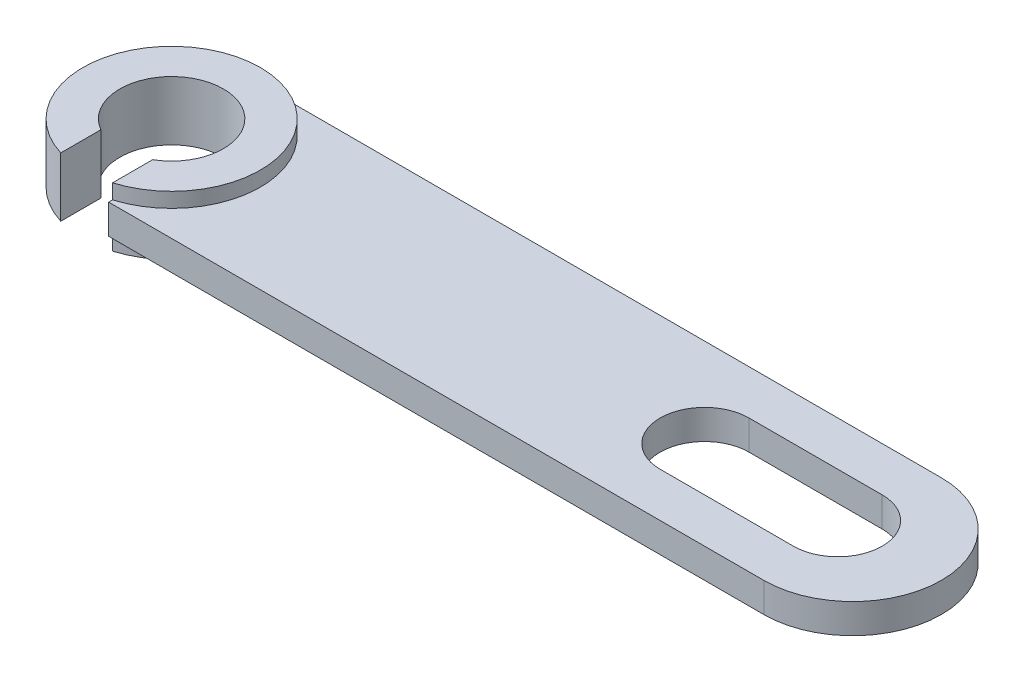
ISO-10303-21;
HEADER;
FILE_DESCRIPTION(('STEP AP214'),'2;1');
FILE_NAME('part.step','',(''),(''),'','','');
FILE_SCHEMA(('AUTOMOTIVE_DESIGN { 1 0 10303 214 1 1 1 1 }'));
ENDSEC;
DATA;
#1=APPLICATION_CONTEXT('core data for automotive mechanical design processes');
#2=APPLICATION_PROTOCOL_DEFINITION('international standard','automotive_design',2000,#1);
#3=PRODUCT_CONTEXT('',#1,'mechanical');
#4=PRODUCT('Part','Part','',(#3));
#5=PRODUCT_RELATED_PRODUCT_CATEGORY('part','',(#4));
#6=PRODUCT_DEFINITION_FORMATION('','',#4);
#7=PRODUCT_DEFINITION_CONTEXT('part definition',#1,'design');
#8=PRODUCT_DEFINITION('design','',#6,#7);
#9=PRODUCT_DEFINITION_SHAPE('','',#8);
#10=(LENGTH_UNIT() NAMED_UNIT(*) SI_UNIT(.MILLI.,.METRE.));
#11=(NAMED_UNIT(*) PLANE_ANGLE_UNIT() SI_UNIT($,.RADIAN.));
#12=(NAMED_UNIT(*) SI_UNIT($,.STERADIAN.) SOLID_ANGLE_UNIT());
#13=UNCERTAINTY_MEASURE_WITH_UNIT(LENGTH_MEASURE(1.E-05),#10,'distance_accuracy_value','');
#14=(GEOMETRIC_REPRESENTATION_CONTEXT(3) GLOBAL_UNCERTAINTY_ASSIGNED_CONTEXT((#13)) GLOBAL_UNIT_ASSIGNED_CONTEXT((#10,
#11,#12)) REPRESENTATION_CONTEXT('',''));
#15=CARTESIAN_POINT('',(0.,0.,0.));
#16=DIRECTION('',(0.,0.,1.));
#17=DIRECTION('',(1.,0.,0.));
#18=AXIS2_PLACEMENT_3D('',#15,#16,#17);
#19=CARTESIAN_POINT('',(-11.5,0.5,0.));
#20=DIRECTION('',(0.,1.,0.));
#21=DIRECTION('',(0.,0.,1.));
#22=AXIS2_PLACEMENT_3D('',#19,#20,#21);
#23=PLANE('',#22);
#24=DIRECTION('',(-1.,0.,0.));
#25=VECTOR('',#24,1.);
#26=CARTESIAN_POINT('',(11.,0.5,-1.5));
#27=LINE('',#26,#25);
#28=CARTESIAN_POINT('',(11.,0.5,-1.5));
#29=VERTEX_POINT('',#28);
#30=CARTESIAN_POINT('',(6.5,0.5,-1.5));
#31=VERTEX_POINT('',#30);
#32=EDGE_CURVE('E186',#29,#31,#27,.T.);
#33=ORIENTED_EDGE('',*,*,#32,.F.);
#34=CARTESIAN_POINT('',(11.,0.5,0.));
#35=DIRECTION('',(0.,1.,0.));
#36=DIRECTION('',(0.,0.,1.));
#37=AXIS2_PLACEMENT_3D('',#34,#35,#36);
#38=CIRCLE('',#37,1.5);
#39=CARTESIAN_POINT('',(11.,0.5,1.5));
#40=VERTEX_POINT('',#39);
#41=EDGE_CURVE('E184',#40,#29,#38,.T.);
#42=ORIENTED_EDGE('',*,*,#41,.F.);
#43=DIRECTION('',(1.,0.,0.));
#44=VECTOR('',#43,1.);
#45=CARTESIAN_POINT('',(11.,0.5,1.5));
#46=LINE('',#45,#44);
#47=CARTESIAN_POINT('',(6.5,0.5,1.5));
#48=VERTEX_POINT('',#47);
#49=EDGE_CURVE('E191',#48,#40,#46,.T.);
#50=ORIENTED_EDGE('',*,*,#49,.F.);
#51=CARTESIAN_POINT('',(6.5,0.5,0.));
#52=DIRECTION('',(0.,1.,0.));
#53=DIRECTION('',(0.,0.,1.));
#54=AXIS2_PLACEMENT_3D('',#51,#52,#53);
#55=CIRCLE('',#54,1.5);
#56=EDGE_CURVE('E189',#31,#48,#55,.T.);
#57=ORIENTED_EDGE('',*,*,#56,.F.);
#58=EDGE_LOOP('',(#33,#42,#50,#57));
#59=FACE_BOUND('',#58,.T.);
#60=DIRECTION('',(-1.,0.,0.));
#61=VECTOR('',#60,1.);
#62=CARTESIAN_POINT('',(-11.5,0.5,-3.));
#63=LINE('',#62,#61);
#64=CARTESIAN_POINT('',(11.5,0.5,-3.));
#65=VERTEX_POINT('',#64);
#66=CARTESIAN_POINT('',(-11.5,0.5,-3.));
#67=VERTEX_POINT('',#66);
#68=EDGE_CURVE('E218',#65,#67,#63,.T.);
#69=ORIENTED_EDGE('',*,*,#68,.T.);
#70=CARTESIAN_POINT('',(-11.5,0.5,0.));
#71=DIRECTION('',(0.,1.,0.));
#72=DIRECTION('',(0.,0.,1.));
#73=AXIS2_PLACEMENT_3D('',#70,#71,#72);
#74=CIRCLE('',#73,3.);
#75=CARTESIAN_POINT('',(-10.625,0.5,2.86956007081225));
#76=VERTEX_POINT('',#75);
#77=EDGE_CURVE('E173',#67,#76,#74,.F.);
#78=ORIENTED_EDGE('',*,*,#77,.T.);
#79=DIRECTION('',(0.,0.,-1.));
#80=VECTOR('',#79,1.);
#81=CARTESIAN_POINT('',(-10.625,0.5,1.51554445662277));
#82=LINE('',#81,#80);
#83=CARTESIAN_POINT('',(-10.625,0.5,3.));
#84=VERTEX_POINT('',#83);
#85=EDGE_CURVE('E176',#84,#76,#82,.T.);
#86=ORIENTED_EDGE('',*,*,#85,.F.);
#87=DIRECTION('',(1.,0.,0.));
#88=VECTOR('',#87,1.);
#89=CARTESIAN_POINT('',(-11.5,0.5,3.));
#90=LINE('',#89,#88);
#91=CARTESIAN_POINT('',(11.5,0.5,3.));
#92=VERTEX_POINT('',#91);
#93=EDGE_CURVE('E213',#84,#92,#90,.T.);
#94=ORIENTED_EDGE('',*,*,#93,.T.);
#95=CARTESIAN_POINT('',(11.5,0.5,0.));
#96=DIRECTION('',(0.,1.,0.));
#97=DIRECTION('',(0.,0.,1.));
#98=AXIS2_PLACEMENT_3D('',#95,#96,#97);
#99=CIRCLE('',#98,3.);
#100=EDGE_CURVE('E215',#92,#65,#99,.T.);
#101=ORIENTED_EDGE('',*,*,#100,.T.);
#102=EDGE_LOOP('',(#69,#78,#86,#94,#101));
#103=FACE_BOUND('',#102,.T.);
#104=ADVANCED_FACE('F34',(#59,#103),#23,.T.);
#105=CARTESIAN_POINT('',(-11.5,-0.5,0.));
#106=DIRECTION('',(0.,1.,0.));
#107=DIRECTION('',(0.,0.,1.));
#108=AXIS2_PLACEMENT_3D('',#105,#106,#107);
#109=PLANE('',#108);
#110=CARTESIAN_POINT('',(11.,-0.5,0.));
#111=DIRECTION('',(0.,1.,0.));
#112=DIRECTION('',(0.,0.,1.));
#113=AXIS2_PLACEMENT_3D('',#110,#111,#112);
#114=CIRCLE('',#113,1.5);
#115=CARTESIAN_POINT('',(11.,-0.5,1.5));
#116=VERTEX_POINT('',#115);
#117=CARTESIAN_POINT('',(11.,-0.5,-1.5));
#118=VERTEX_POINT('',#117);
#119=EDGE_CURVE('E181',#116,#118,#114,.T.);
#120=ORIENTED_EDGE('',*,*,#119,.T.);
#121=DIRECTION('',(-1.,0.,0.));
#122=VECTOR('',#121,1.);
#123=CARTESIAN_POINT('',(11.,-0.5,-1.5));
#124=LINE('',#123,#122);
#125=CARTESIAN_POINT('',(6.5,-0.5,-1.5));
#126=VERTEX_POINT('',#125);
#127=EDGE_CURVE('E196',#118,#126,#124,.T.);
#128=ORIENTED_EDGE('',*,*,#127,.T.);
#129=CARTESIAN_POINT('',(6.5,-0.5,0.));
#130=DIRECTION('',(0.,1.,0.));
#131=DIRECTION('',(0.,0.,1.));
#132=AXIS2_PLACEMENT_3D('',#129,#130,#131);
#133=CIRCLE('',#132,1.5);
#134=CARTESIAN_POINT('',(6.5,-0.5,1.5));
#135=VERTEX_POINT('',#134);
#136=EDGE_CURVE('E199',#126,#135,#133,.T.);
#137=ORIENTED_EDGE('',*,*,#136,.T.);
#138=DIRECTION('',(1.,0.,0.));
#139=VECTOR('',#138,1.);
#140=CARTESIAN_POINT('',(11.,-0.5,1.5));
#141=LINE('',#140,#139);
#142=EDGE_CURVE('E187',#135,#116,#141,.T.);
#143=ORIENTED_EDGE('',*,*,#142,.T.);
#144=EDGE_LOOP('',(#120,#128,#137,#143));
#145=FACE_BOUND('',#144,.T.);
#146=CARTESIAN_POINT('',(-11.5,-0.5,0.));
#147=DIRECTION('',(0.,1.,0.));
#148=DIRECTION('',(0.,0.,1.));
#149=AXIS2_PLACEMENT_3D('',#146,#147,#148);
#150=CIRCLE('',#149,3.);
#151=CARTESIAN_POINT('',(-11.5,-0.5,-3.));
#152=VERTEX_POINT('',#151);
#153=CARTESIAN_POINT('',(-10.625,-0.5,2.86956007081225));
#154=VERTEX_POINT('',#153);
#155=EDGE_CURVE('E171',#152,#154,#150,.F.);
#156=ORIENTED_EDGE('',*,*,#155,.F.);
#157=DIRECTION('',(-1.,0.,0.));
#158=VECTOR('',#157,1.);
#159=CARTESIAN_POINT('',(-11.5,-0.5,-3.));
#160=LINE('',#159,#158);
#161=CARTESIAN_POINT('',(11.5,-0.5,-3.));
#162=VERTEX_POINT('',#161);
#163=EDGE_CURVE('E216',#162,#152,#160,.T.);
#164=ORIENTED_EDGE('',*,*,#163,.F.);
#165=CARTESIAN_POINT('',(11.5,-0.5,0.));
#166=DIRECTION('',(0.,1.,0.));
#167=DIRECTION('',(0.,0.,1.));
#168=AXIS2_PLACEMENT_3D('',#165,#166,#167);
#169=CIRCLE('',#168,3.);
#170=CARTESIAN_POINT('',(11.5,-0.5,3.));
#171=VERTEX_POINT('',#170);
#172=EDGE_CURVE('E223',#171,#162,#169,.T.);
#173=ORIENTED_EDGE('',*,*,#172,.F.);
#174=DIRECTION('',(1.,0.,0.));
#175=VECTOR('',#174,1.);
#176=CARTESIAN_POINT('',(-11.5,-0.5,3.));
#177=LINE('',#176,#175);
#178=CARTESIAN_POINT('',(-10.625,-0.5,3.));
#179=VERTEX_POINT('',#178);
#180=EDGE_CURVE('E212',#179,#171,#177,.T.);
#181=ORIENTED_EDGE('',*,*,#180,.F.);
#182=DIRECTION('',(0.,0.,-1.));
#183=VECTOR('',#182,1.);
#184=CARTESIAN_POINT('',(-10.625,-0.5,1.51554445662277));
#185=LINE('',#184,#183);
#186=EDGE_CURVE('E49',#179,#154,#185,.T.);
#187=ORIENTED_EDGE('',*,*,#186,.T.);
#188=EDGE_LOOP('',(#156,#164,#173,#181,#187));
#189=FACE_BOUND('',#188,.T.);
#190=ADVANCED_FACE('F238',(#145,#189),#109,.F.);
#191=CARTESIAN_POINT('',(-11.5,0.5,0.));
#192=DIRECTION('',(0.,-1.,0.));
#193=DIRECTION('',(0.,0.,-1.));
#194=AXIS2_PLACEMENT_3D('',#191,#192,#193);
#195=CYLINDRICAL_SURFACE('',#194,3.);
#196=DIRECTION('',(0.,-1.,0.));
#197=VECTOR('',#196,1.);
#198=CARTESIAN_POINT('',(-11.5,0.5,-3.));
#199=LINE('',#198,#197);
#200=EDGE_CURVE('E221',#67,#152,#199,.T.);
#201=ORIENTED_EDGE('',*,*,#200,.T.);
#202=ORIENTED_EDGE('',*,*,#155,.T.);
#203=DIRECTION('',(0.,-1.,0.));
#204=VECTOR('',#203,1.);
#205=CARTESIAN_POINT('',(-10.625,1.,2.86956007081225));
#206=LINE('',#205,#204);
#207=CARTESIAN_POINT('',(-10.625,-1.,2.86956007081225));
#208=VERTEX_POINT('',#207);
#209=EDGE_CURVE('E164',#154,#208,#206,.T.);
#210=ORIENTED_EDGE('',*,*,#209,.T.);
#211=CARTESIAN_POINT('',(-11.5,-1.,0.));
#212=DIRECTION('',(0.,1.,0.));
#213=DIRECTION('',(0.,0.,1.));
#214=AXIS2_PLACEMENT_3D('',#211,#212,#213);
#215=CIRCLE('',#214,3.);
#216=CARTESIAN_POINT('',(-12.375,-1.,2.86956007081225));
#217=VERTEX_POINT('',#216);
#218=EDGE_CURVE('E159',#208,#217,#215,.T.);
#219=ORIENTED_EDGE('',*,*,#218,.T.);
#220=DIRECTION('',(0.,1.,0.));
#221=VECTOR('',#220,1.);
#222=CARTESIAN_POINT('',(-12.375,-0.5,2.86956007081225));
#223=LINE('',#222,#221);
#224=CARTESIAN_POINT('',(-12.375,1.,2.86956007081225));
#225=VERTEX_POINT('',#224);
#226=EDGE_CURVE('E179',#217,#225,#223,.T.);
#227=ORIENTED_EDGE('',*,*,#226,.T.);
#228=CARTESIAN_POINT('',(-11.5,1.,0.));
#229=DIRECTION('',(0.,1.,0.));
#230=DIRECTION('',(0.,0.,1.));
#231=AXIS2_PLACEMENT_3D('',#228,#229,#230);
#232=CIRCLE('',#231,3.);
#233=CARTESIAN_POINT('',(-10.625,1.,2.86956007081225));
#234=VERTEX_POINT('',#233);
#235=EDGE_CURVE('E150',#234,#225,#232,.T.);
#236=ORIENTED_EDGE('',*,*,#235,.F.);
#237=EDGE_CURVE('E146',#234,#76,#206,.T.);
#238=ORIENTED_EDGE('',*,*,#237,.T.);
#239=ORIENTED_EDGE('',*,*,#77,.F.);
#240=EDGE_LOOP('',(#201,#202,#210,#219,#227,#236,#238,#239));
#241=FACE_BOUND('',#240,.T.);
#242=ADVANCED_FACE('F36',(#241),#195,.T.);
#243=CARTESIAN_POINT('',(-11.5,0.5,3.));
#244=DIRECTION('',(0.,0.,-1.));
#245=DIRECTION('',(-1.,0.,0.));
#246=AXIS2_PLACEMENT_3D('',#243,#244,#245);
#247=PLANE('',#246);
#248=ORIENTED_EDGE('',*,*,#93,.F.);
#249=DIRECTION('',(0.,1.,0.));
#250=VECTOR('',#249,1.);
#251=CARTESIAN_POINT('',(-10.625,-0.5,3.));
#252=LINE('',#251,#250);
#253=EDGE_CURVE('E140',#179,#84,#252,.T.);
#254=ORIENTED_EDGE('',*,*,#253,.F.);
#255=ORIENTED_EDGE('',*,*,#180,.T.);
#256=DIRECTION('',(0.,-1.,0.));
#257=VECTOR('',#256,1.);
#258=CARTESIAN_POINT('',(11.5,0.5,3.));
#259=LINE('',#258,#257);
#260=EDGE_CURVE('E11',#92,#171,#259,.T.);
#261=ORIENTED_EDGE('',*,*,#260,.F.);
#262=EDGE_LOOP('',(#248,#254,#255,#261));
#263=FACE_BOUND('',#262,.T.);
#264=ADVANCED_FACE('F274',(#263),#247,.F.);
#265=CARTESIAN_POINT('',(11.5,0.5,0.));
#266=DIRECTION('',(0.,-1.,0.));
#267=DIRECTION('',(0.,0.,-1.));
#268=AXIS2_PLACEMENT_3D('',#265,#266,#267);
#269=CYLINDRICAL_SURFACE('',#268,3.);
#270=ORIENTED_EDGE('',*,*,#172,.T.);
#271=DIRECTION('',(0.,-1.,0.));
#272=VECTOR('',#271,1.);
#273=CARTESIAN_POINT('',(11.5,0.5,-3.));
#274=LINE('',#273,#272);
#275=EDGE_CURVE('E42',#65,#162,#274,.T.);
#276=ORIENTED_EDGE('',*,*,#275,.F.);
#277=ORIENTED_EDGE('',*,*,#100,.F.);
#278=ORIENTED_EDGE('',*,*,#260,.T.);
#279=EDGE_LOOP('',(#270,#276,#277,#278));
#280=FACE_BOUND('',#279,.T.);
#281=ADVANCED_FACE('F272',(#280),#269,.T.);
#282=CARTESIAN_POINT('',(-11.5,0.5,-3.));
#283=DIRECTION('',(0.,0.,1.));
#284=DIRECTION('',(1.,0.,0.));
#285=AXIS2_PLACEMENT_3D('',#282,#283,#284);
#286=PLANE('',#285);
#287=ORIENTED_EDGE('',*,*,#163,.T.);
#288=ORIENTED_EDGE('',*,*,#200,.F.);
#289=ORIENTED_EDGE('',*,*,#68,.F.);
#290=ORIENTED_EDGE('',*,*,#275,.T.);
#291=EDGE_LOOP('',(#287,#288,#289,#290));
#292=FACE_BOUND('',#291,.T.);
#293=ADVANCED_FACE('F233',(#292),#286,.F.);
#294=CARTESIAN_POINT('',(11.,0.5,0.));
#295=DIRECTION('',(0.,-1.,0.));
#296=DIRECTION('',(0.,0.,-1.));
#297=AXIS2_PLACEMENT_3D('',#294,#295,#296);
#298=CYLINDRICAL_SURFACE('',#297,1.5);
#299=ORIENTED_EDGE('',*,*,#119,.F.);
#300=DIRECTION('',(0.,-1.,0.));
#301=VECTOR('',#300,1.);
#302=CARTESIAN_POINT('',(11.,0.5,1.5));
#303=LINE('',#302,#301);
#304=EDGE_CURVE('E193',#40,#116,#303,.T.);
#305=ORIENTED_EDGE('',*,*,#304,.F.);
#306=ORIENTED_EDGE('',*,*,#41,.T.);
#307=DIRECTION('',(0.,-1.,0.));
#308=VECTOR('',#307,1.);
#309=CARTESIAN_POINT('',(11.,0.5,-1.5));
#310=LINE('',#309,#308);
#311=EDGE_CURVE('E209',#29,#118,#310,.T.);
#312=ORIENTED_EDGE('',*,*,#311,.T.);
#313=EDGE_LOOP('',(#299,#305,#306,#312));
#314=FACE_BOUND('',#313,.T.);
#315=ADVANCED_FACE('F267',(#314),#298,.F.);
#316=CARTESIAN_POINT('',(11.,0.5,-1.5));
#317=DIRECTION('',(0.,0.,1.));
#318=DIRECTION('',(1.,0.,0.));
#319=AXIS2_PLACEMENT_3D('',#316,#317,#318);
#320=PLANE('',#319);
#321=ORIENTED_EDGE('',*,*,#127,.F.);
#322=ORIENTED_EDGE('',*,*,#311,.F.);
#323=ORIENTED_EDGE('',*,*,#32,.T.);
#324=DIRECTION('',(0.,-1.,0.));
#325=VECTOR('',#324,1.);
#326=CARTESIAN_POINT('',(6.5,0.5,-1.5));
#327=LINE('',#326,#325);
#328=EDGE_CURVE('E207',#31,#126,#327,.T.);
#329=ORIENTED_EDGE('',*,*,#328,.T.);
#330=EDGE_LOOP('',(#321,#322,#323,#329));
#331=FACE_BOUND('',#330,.T.);
#332=ADVANCED_FACE('F322',(#331),#320,.T.);
#333=CARTESIAN_POINT('',(6.5,0.5,0.));
#334=DIRECTION('',(0.,-1.,0.));
#335=DIRECTION('',(0.,0.,-1.));
#336=AXIS2_PLACEMENT_3D('',#333,#334,#335);
#337=CYLINDRICAL_SURFACE('',#336,1.5);
#338=ORIENTED_EDGE('',*,*,#136,.F.);
#339=ORIENTED_EDGE('',*,*,#328,.F.);
#340=ORIENTED_EDGE('',*,*,#56,.T.);
#341=DIRECTION('',(0.,-1.,0.));
#342=VECTOR('',#341,1.);
#343=CARTESIAN_POINT('',(6.5,0.5,1.5));
#344=LINE('',#343,#342);
#345=EDGE_CURVE('E57',#48,#135,#344,.T.);
#346=ORIENTED_EDGE('',*,*,#345,.T.);
#347=EDGE_LOOP('',(#338,#339,#340,#346));
#348=FACE_BOUND('',#347,.T.);
#349=ADVANCED_FACE('F311',(#348),#337,.F.);
#350=CARTESIAN_POINT('',(11.,0.5,1.5));
#351=DIRECTION('',(0.,0.,-1.));
#352=DIRECTION('',(-1.,0.,0.));
#353=AXIS2_PLACEMENT_3D('',#350,#351,#352);
#354=PLANE('',#353);
#355=ORIENTED_EDGE('',*,*,#142,.F.);
#356=ORIENTED_EDGE('',*,*,#345,.F.);
#357=ORIENTED_EDGE('',*,*,#49,.T.);
#358=ORIENTED_EDGE('',*,*,#304,.T.);
#359=EDGE_LOOP('',(#355,#356,#357,#358));
#360=FACE_BOUND('',#359,.T.);
#361=ADVANCED_FACE('F306',(#360),#354,.T.);
#362=CARTESIAN_POINT('',(-11.5,0.5,0.));
#363=DIRECTION('',(0.,-1.,0.));
#364=DIRECTION('',(0.,0.,-1.));
#365=AXIS2_PLACEMENT_3D('',#362,#363,#364);
#366=CYLINDRICAL_SURFACE('',#365,1.75);
#367=DIRECTION('',(0.,1.,0.));
#368=VECTOR('',#367,1.);
#369=CARTESIAN_POINT('',(-12.375,-0.5,1.51554445662277));
#370=LINE('',#369,#368);
#371=CARTESIAN_POINT('',(-12.375,-1.,1.51554445662277));
#372=VERTEX_POINT('',#371);
#373=CARTESIAN_POINT('',(-12.375,1.,1.51554445662277));
#374=VERTEX_POINT('',#373);
#375=EDGE_CURVE('E139',#372,#374,#370,.T.);
#376=ORIENTED_EDGE('',*,*,#375,.F.);
#377=CARTESIAN_POINT('',(-11.5,-1.,0.));
#378=DIRECTION('',(0.,-1.,0.));
#379=DIRECTION('',(0.,0.,1.));
#380=AXIS2_PLACEMENT_3D('',#377,#378,#379);
#381=CIRCLE('',#380,1.75);
#382=CARTESIAN_POINT('',(-10.625,-1.,1.51554445662277));
#383=VERTEX_POINT('',#382);
#384=EDGE_CURVE('E135',#372,#383,#381,.T.);
#385=ORIENTED_EDGE('',*,*,#384,.T.);
#386=DIRECTION('',(0.,1.,0.));
#387=VECTOR('',#386,1.);
#388=CARTESIAN_POINT('',(-10.625,-0.5,1.51554445662277));
#389=LINE('',#388,#387);
#390=CARTESIAN_POINT('',(-10.625,1.,1.51554445662277));
#391=VERTEX_POINT('',#390);
#392=EDGE_CURVE('E129',#383,#391,#389,.T.);
#393=ORIENTED_EDGE('',*,*,#392,.T.);
#394=CARTESIAN_POINT('',(-11.5,1.,0.));
#395=DIRECTION('',(0.,-1.,0.));
#396=DIRECTION('',(0.,0.,1.));
#397=AXIS2_PLACEMENT_3D('',#394,#395,#396);
#398=CIRCLE('',#397,1.75);
#399=EDGE_CURVE('E133',#374,#391,#398,.T.);
#400=ORIENTED_EDGE('',*,*,#399,.F.);
#401=EDGE_LOOP('',(#376,#385,#393,#400));
#402=FACE_BOUND('',#401,.T.);
#403=ADVANCED_FACE('F131',(#402),#366,.F.);
#404=CARTESIAN_POINT('',(-10.625,-0.5,1.51554445662277));
#405=DIRECTION('',(1.,0.,0.));
#406=DIRECTION('',(0.,0.,-1.));
#407=AXIS2_PLACEMENT_3D('',#404,#405,#406);
#408=PLANE('',#407);
#409=ORIENTED_EDGE('',*,*,#392,.F.);
#410=DIRECTION('',(0.,0.,1.));
#411=VECTOR('',#410,1.);
#412=CARTESIAN_POINT('',(-10.625,-1.,2.86956007081225));
#413=LINE('',#412,#411);
#414=EDGE_CURVE('E166',#383,#208,#413,.T.);
#415=ORIENTED_EDGE('',*,*,#414,.T.);
#416=ORIENTED_EDGE('',*,*,#209,.F.);
#417=ORIENTED_EDGE('',*,*,#186,.F.);
#418=ORIENTED_EDGE('',*,*,#253,.T.);
#419=ORIENTED_EDGE('',*,*,#85,.T.);
#420=ORIENTED_EDGE('',*,*,#237,.F.);
#421=DIRECTION('',(0.,0.,1.));
#422=VECTOR('',#421,1.);
#423=CARTESIAN_POINT('',(-10.625,1.,2.86956007081225));
#424=LINE('',#423,#422);
#425=EDGE_CURVE('E143',#391,#234,#424,.T.);
#426=ORIENTED_EDGE('',*,*,#425,.F.);
#427=EDGE_LOOP('',(#409,#415,#416,#417,#418,#419,#420,#426));
#428=FACE_BOUND('',#427,.T.);
#429=ADVANCED_FACE('F144',(#428),#408,.F.);
#430=CARTESIAN_POINT('',(-12.375,-0.5,1.51554445662277));
#431=DIRECTION('',(-1.,0.,0.));
#432=DIRECTION('',(0.,0.,1.));
#433=AXIS2_PLACEMENT_3D('',#430,#431,#432);
#434=PLANE('',#433);
#435=ORIENTED_EDGE('',*,*,#226,.F.);
#436=DIRECTION('',(0.,0.,-1.));
#437=VECTOR('',#436,1.);
#438=CARTESIAN_POINT('',(-12.375,-1.,1.51554445662277));
#439=LINE('',#438,#437);
#440=EDGE_CURVE('E156',#217,#372,#439,.T.);
#441=ORIENTED_EDGE('',*,*,#440,.T.);
#442=ORIENTED_EDGE('',*,*,#375,.T.);
#443=DIRECTION('',(0.,0.,-1.));
#444=VECTOR('',#443,1.);
#445=CARTESIAN_POINT('',(-12.375,1.,1.51554445662277));
#446=LINE('',#445,#444);
#447=EDGE_CURVE('E155',#225,#374,#446,.T.);
#448=ORIENTED_EDGE('',*,*,#447,.F.);
#449=EDGE_LOOP('',(#435,#441,#442,#448));
#450=FACE_BOUND('',#449,.T.);
#451=ADVANCED_FACE('F247',(#450),#434,.F.);
#452=CARTESIAN_POINT('',(-11.5,-1.,0.));
#453=DIRECTION('',(0.,1.,0.));
#454=DIRECTION('',(0.,0.,1.));
#455=AXIS2_PLACEMENT_3D('',#452,#453,#454);
#456=PLANE('',#455);
#457=ORIENTED_EDGE('',*,*,#384,.F.);
#458=ORIENTED_EDGE('',*,*,#440,.F.);
#459=ORIENTED_EDGE('',*,*,#218,.F.);
#460=ORIENTED_EDGE('',*,*,#414,.F.);
#461=EDGE_LOOP('',(#457,#458,#459,#460));
#462=FACE_BOUND('',#461,.T.);
#463=ADVANCED_FACE('F245',(#462),#456,.F.);
#464=CARTESIAN_POINT('',(-11.5,1.,0.));
#465=DIRECTION('',(0.,1.,0.));
#466=DIRECTION('',(0.,0.,1.));
#467=AXIS2_PLACEMENT_3D('',#464,#465,#466);
#468=PLANE('',#467);
#469=ORIENTED_EDGE('',*,*,#399,.T.);
#470=ORIENTED_EDGE('',*,*,#425,.T.);
#471=ORIENTED_EDGE('',*,*,#235,.T.);
#472=ORIENTED_EDGE('',*,*,#447,.T.);
#473=EDGE_LOOP('',(#469,#470,#471,#472));
#474=FACE_BOUND('',#473,.T.);
#475=ADVANCED_FACE('F153',(#474),#468,.T.);
#476=CLOSED_SHELL('',(#104,#190,#242,#264,#281,#293,#315,#332,#349,#361,#403,#429,#451,#463,#475));
#477=MANIFOLD_SOLID_BREP('B2',#476);
#478=ADVANCED_BREP_SHAPE_REPRESENTATION('',(#18,#477),#14);
#479=SHAPE_DEFINITION_REPRESENTATION(#9,#478);
ENDSEC;
END-ISO-10303-21;
